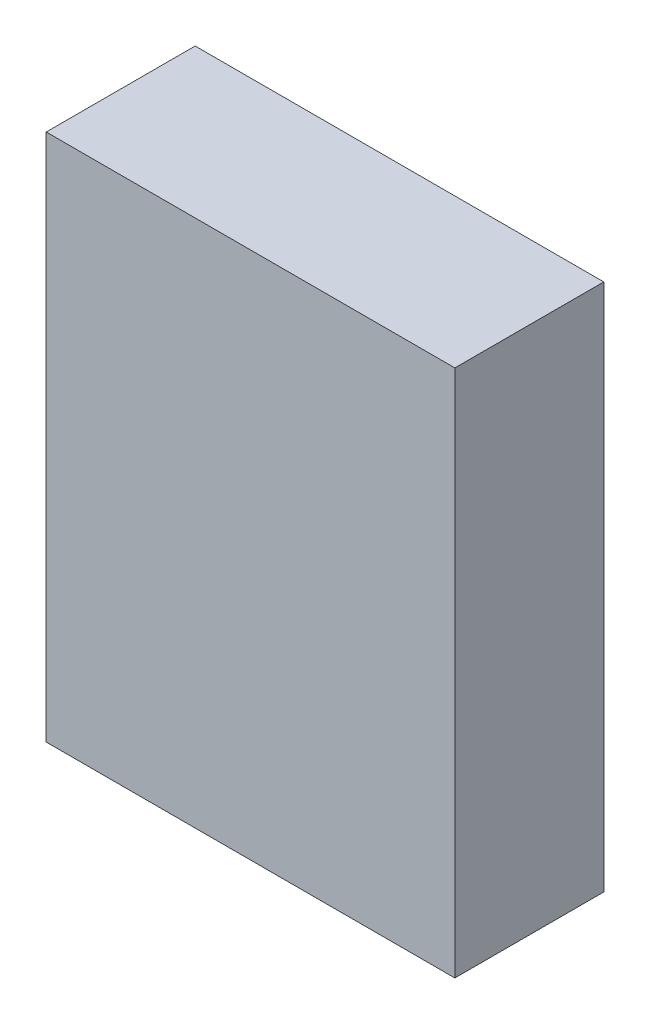
ISO-10303-21;
HEADER;
FILE_DESCRIPTION(('STEP AP214'),'2;1');
FILE_NAME('part.step','',(''),(''),'','','');
FILE_SCHEMA(('AUTOMOTIVE_DESIGN { 1 0 10303 214 1 1 1 1 }'));
ENDSEC;
DATA;
#1=APPLICATION_CONTEXT('core data for automotive mechanical design processes');
#2=APPLICATION_PROTOCOL_DEFINITION('international standard','automotive_design',2000,#1);
#3=PRODUCT_CONTEXT('',#1,'mechanical');
#4=PRODUCT('Part','Part','',(#3));
#5=PRODUCT_RELATED_PRODUCT_CATEGORY('part','',(#4));
#6=PRODUCT_DEFINITION_FORMATION('','',#4);
#7=PRODUCT_DEFINITION_CONTEXT('part definition',#1,'design');
#8=PRODUCT_DEFINITION('design','',#6,#7);
#9=PRODUCT_DEFINITION_SHAPE('','',#8);
#10=(LENGTH_UNIT() NAMED_UNIT(*) SI_UNIT(.MILLI.,.METRE.));
#11=(NAMED_UNIT(*) PLANE_ANGLE_UNIT() SI_UNIT($,.RADIAN.));
#12=(NAMED_UNIT(*) SI_UNIT($,.STERADIAN.) SOLID_ANGLE_UNIT());
#13=UNCERTAINTY_MEASURE_WITH_UNIT(LENGTH_MEASURE(1.E-05),#10,'distance_accuracy_value','');
#14=(GEOMETRIC_REPRESENTATION_CONTEXT(3) GLOBAL_UNCERTAINTY_ASSIGNED_CONTEXT((#13)) GLOBAL_UNIT_ASSIGNED_CONTEXT((#10,
#11,#12)) REPRESENTATION_CONTEXT('',''));
#15=CARTESIAN_POINT('',(0.,0.,0.));
#16=DIRECTION('',(0.,0.,1.));
#17=DIRECTION('',(1.,0.,0.));
#18=AXIS2_PLACEMENT_3D('',#15,#16,#17);
#19=CARTESIAN_POINT('',(-770.865122613719,173.479969002098,10.26));
#20=DIRECTION('',(1.,0.,0.));
#21=DIRECTION('',(0.,0.,-1.));
#22=AXIS2_PLACEMENT_3D('',#19,#20,#21);
#23=PLANE('',#22);
#24=DIRECTION('',(0.,-1.,0.));
#25=VECTOR('',#24,1.);
#26=CARTESIAN_POINT('',(-770.865122613719,173.479969002098,0.));
#27=LINE('',#26,#25);
#28=CARTESIAN_POINT('',(-770.865122613719,173.479969002098,0.));
#29=VERTEX_POINT('',#28);
#30=CARTESIAN_POINT('',(-770.865122613719,137.079969002098,0.));
#31=VERTEX_POINT('',#30);
#32=EDGE_CURVE('E96',#29,#31,#27,.T.);
#33=ORIENTED_EDGE('',*,*,#32,.T.);
#34=DIRECTION('',(0.,0.,-1.));
#35=VECTOR('',#34,1.);
#36=CARTESIAN_POINT('',(-770.865122613719,137.079969002098,10.26));
#37=LINE('',#36,#35);
#38=CARTESIAN_POINT('',(-770.865122613719,137.079969002098,10.26));
#39=VERTEX_POINT('',#38);
#40=EDGE_CURVE('E11',#39,#31,#37,.T.);
#41=ORIENTED_EDGE('',*,*,#40,.F.);
#42=DIRECTION('',(0.,-1.,0.));
#43=VECTOR('',#42,1.);
#44=CARTESIAN_POINT('',(-770.865122613719,173.479969002098,10.26));
#45=LINE('',#44,#43);
#46=CARTESIAN_POINT('',(-770.865122613719,173.479969002098,10.26));
#47=VERTEX_POINT('',#46);
#48=EDGE_CURVE('E84',#47,#39,#45,.T.);
#49=ORIENTED_EDGE('',*,*,#48,.F.);
#50=DIRECTION('',(0.,0.,-1.));
#51=VECTOR('',#50,1.);
#52=CARTESIAN_POINT('',(-770.865122613719,173.479969002098,10.26));
#53=LINE('',#52,#51);
#54=EDGE_CURVE('E92',#47,#29,#53,.T.);
#55=ORIENTED_EDGE('',*,*,#54,.T.);
#56=EDGE_LOOP('',(#33,#41,#49,#55));
#57=FACE_BOUND('',#56,.T.);
#58=ADVANCED_FACE('F33',(#57),#23,.F.);
#59=CARTESIAN_POINT('',(-770.865122613719,137.079969002098,10.26));
#60=DIRECTION('',(0.,1.,0.));
#61=DIRECTION('',(0.,0.,1.));
#62=AXIS2_PLACEMENT_3D('',#59,#60,#61);
#63=PLANE('',#62);
#64=DIRECTION('',(1.,0.,0.));
#65=VECTOR('',#64,1.);
#66=CARTESIAN_POINT('',(-770.865122613719,137.079969002098,0.));
#67=LINE('',#66,#65);
#68=CARTESIAN_POINT('',(-742.715122613719,137.079969002098,0.));
#69=VERTEX_POINT('',#68);
#70=EDGE_CURVE('E88',#31,#69,#67,.T.);
#71=ORIENTED_EDGE('',*,*,#70,.T.);
#72=DIRECTION('',(0.,0.,-1.));
#73=VECTOR('',#72,1.);
#74=CARTESIAN_POINT('',(-742.715122613719,137.079969002098,10.26));
#75=LINE('',#74,#73);
#76=CARTESIAN_POINT('',(-742.715122613719,137.079969002098,10.26));
#77=VERTEX_POINT('',#76);
#78=EDGE_CURVE('E41',#77,#69,#75,.T.);
#79=ORIENTED_EDGE('',*,*,#78,.F.);
#80=DIRECTION('',(1.,0.,0.));
#81=VECTOR('',#80,1.);
#82=CARTESIAN_POINT('',(-770.865122613719,137.079969002098,10.26));
#83=LINE('',#82,#81);
#84=EDGE_CURVE('E79',#39,#77,#83,.T.);
#85=ORIENTED_EDGE('',*,*,#84,.F.);
#86=ORIENTED_EDGE('',*,*,#40,.T.);
#87=EDGE_LOOP('',(#71,#79,#85,#86));
#88=FACE_BOUND('',#87,.T.);
#89=ADVANCED_FACE('F87',(#88),#63,.F.);
#90=CARTESIAN_POINT('',(-742.715122613719,173.479969002098,10.26));
#91=DIRECTION('',(-1.,0.,0.));
#92=DIRECTION('',(0.,0.,1.));
#93=AXIS2_PLACEMENT_3D('',#90,#91,#92);
#94=PLANE('',#93);
#95=DIRECTION('',(0.,1.,0.));
#96=VECTOR('',#95,1.);
#97=CARTESIAN_POINT('',(-742.715122613719,173.479969002098,0.));
#98=LINE('',#97,#96);
#99=CARTESIAN_POINT('',(-742.715122613719,173.479969002098,0.));
#100=VERTEX_POINT('',#99);
#101=EDGE_CURVE('E66',#69,#100,#98,.T.);
#102=ORIENTED_EDGE('',*,*,#101,.T.);
#103=DIRECTION('',(0.,0.,-1.));
#104=VECTOR('',#103,1.);
#105=CARTESIAN_POINT('',(-742.715122613719,173.479969002098,10.26));
#106=LINE('',#105,#104);
#107=CARTESIAN_POINT('',(-742.715122613719,173.479969002098,10.26));
#108=VERTEX_POINT('',#107);
#109=EDGE_CURVE('E89',#108,#100,#106,.T.);
#110=ORIENTED_EDGE('',*,*,#109,.F.);
#111=DIRECTION('',(0.,1.,0.));
#112=VECTOR('',#111,1.);
#113=CARTESIAN_POINT('',(-742.715122613719,173.479969002098,10.26));
#114=LINE('',#113,#112);
#115=EDGE_CURVE('E82',#77,#108,#114,.T.);
#116=ORIENTED_EDGE('',*,*,#115,.F.);
#117=ORIENTED_EDGE('',*,*,#78,.T.);
#118=EDGE_LOOP('',(#102,#110,#116,#117));
#119=FACE_BOUND('',#118,.T.);
#120=ADVANCED_FACE('F90',(#119),#94,.F.);
#121=CARTESIAN_POINT('',(-770.865122613719,173.479969002098,10.26));
#122=DIRECTION('',(0.,-1.,0.));
#123=DIRECTION('',(0.,0.,-1.));
#124=AXIS2_PLACEMENT_3D('',#121,#122,#123);
#125=PLANE('',#124);
#126=DIRECTION('',(-1.,0.,0.));
#127=VECTOR('',#126,1.);
#128=CARTESIAN_POINT('',(-770.865122613719,173.479969002098,0.));
#129=LINE('',#128,#127);
#130=EDGE_CURVE('E72',#100,#29,#129,.T.);
#131=ORIENTED_EDGE('',*,*,#130,.T.);
#132=ORIENTED_EDGE('',*,*,#54,.F.);
#133=DIRECTION('',(-1.,0.,0.));
#134=VECTOR('',#133,1.);
#135=CARTESIAN_POINT('',(-770.865122613719,173.479969002098,10.26));
#136=LINE('',#135,#134);
#137=EDGE_CURVE('E49',#108,#47,#136,.T.);
#138=ORIENTED_EDGE('',*,*,#137,.F.);
#139=ORIENTED_EDGE('',*,*,#109,.T.);
#140=EDGE_LOOP('',(#131,#132,#138,#139));
#141=FACE_BOUND('',#140,.T.);
#142=ADVANCED_FACE('F103',(#141),#125,.F.);
#143=CARTESIAN_POINT('',(0.,0.,10.26));
#144=DIRECTION('',(0.,0.,1.));
#145=DIRECTION('',(1.,0.,0.));
#146=AXIS2_PLACEMENT_3D('',#143,#144,#145);
#147=PLANE('',#146);
#148=ORIENTED_EDGE('',*,*,#48,.T.);
#149=ORIENTED_EDGE('',*,*,#84,.T.);
#150=ORIENTED_EDGE('',*,*,#115,.T.);
#151=ORIENTED_EDGE('',*,*,#137,.T.);
#152=EDGE_LOOP('',(#148,#149,#150,#151));
#153=FACE_BOUND('',#152,.T.);
#154=ADVANCED_FACE('F80',(#153),#147,.T.);
#155=CARTESIAN_POINT('',(0.,0.,0.));
#156=DIRECTION('',(0.,0.,1.));
#157=DIRECTION('',(1.,0.,0.));
#158=AXIS2_PLACEMENT_3D('',#155,#156,#157);
#159=PLANE('',#158);
#160=ORIENTED_EDGE('',*,*,#32,.F.);
#161=ORIENTED_EDGE('',*,*,#130,.F.);
#162=ORIENTED_EDGE('',*,*,#101,.F.);
#163=ORIENTED_EDGE('',*,*,#70,.F.);
#164=EDGE_LOOP('',(#160,#161,#162,#163));
#165=FACE_BOUND('',#164,.T.);
#166=ADVANCED_FACE('F106',(#165),#159,.F.);
#167=CLOSED_SHELL('',(#58,#89,#120,#142,#154,#166));
#168=MANIFOLD_SOLID_BREP('B2',#167);
#169=ADVANCED_BREP_SHAPE_REPRESENTATION('',(#18,#168),#14);
#170=SHAPE_DEFINITION_REPRESENTATION(#9,#169);
ENDSEC;
END-ISO-10303-21;
